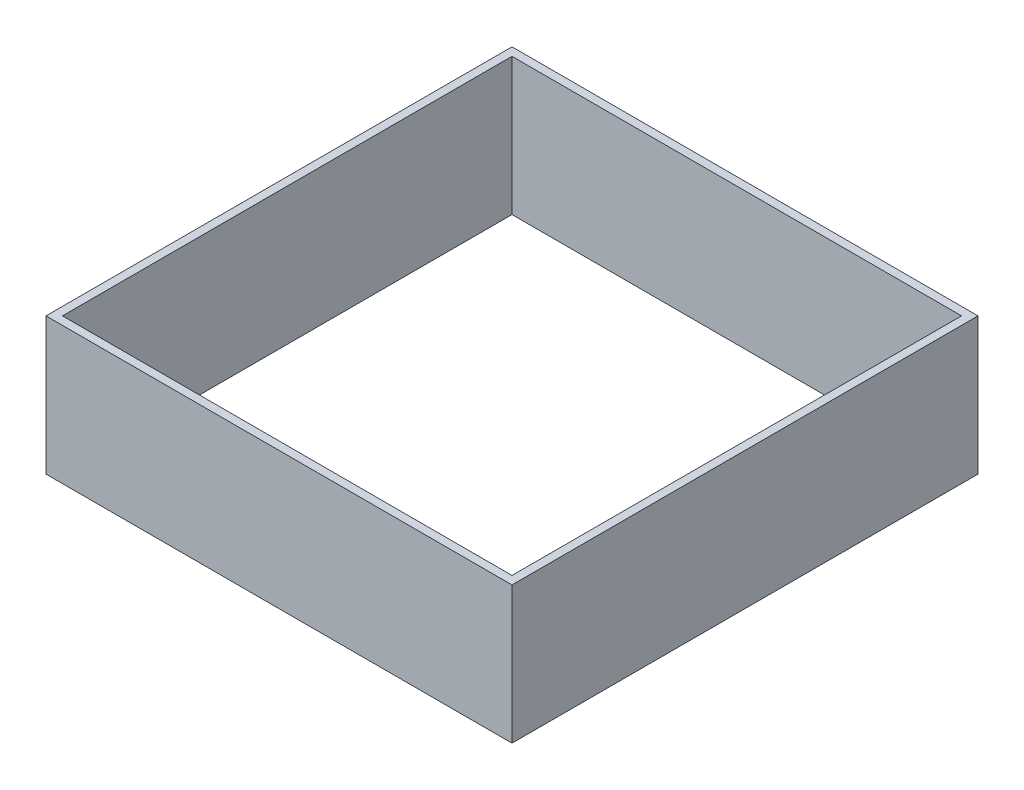
ISO-10303-21;
HEADER;
FILE_DESCRIPTION(('STEP AP214'),'2;1');
FILE_NAME('part.step','',(''),(''),'','','');
FILE_SCHEMA(('AUTOMOTIVE_DESIGN { 1 0 10303 214 1 1 1 1 }'));
ENDSEC;
DATA;
#1=APPLICATION_CONTEXT('core data for automotive mechanical design processes');
#2=APPLICATION_PROTOCOL_DEFINITION('international standard','automotive_design',2000,#1);
#3=PRODUCT_CONTEXT('',#1,'mechanical');
#4=PRODUCT('Part','Part','',(#3));
#5=PRODUCT_RELATED_PRODUCT_CATEGORY('part','',(#4));
#6=PRODUCT_DEFINITION_FORMATION('','',#4);
#7=PRODUCT_DEFINITION_CONTEXT('part definition',#1,'design');
#8=PRODUCT_DEFINITION('design','',#6,#7);
#9=PRODUCT_DEFINITION_SHAPE('','',#8);
#10=(LENGTH_UNIT() NAMED_UNIT(*) SI_UNIT(.MILLI.,.METRE.));
#11=(NAMED_UNIT(*) PLANE_ANGLE_UNIT() SI_UNIT($,.RADIAN.));
#12=(NAMED_UNIT(*) SI_UNIT($,.STERADIAN.) SOLID_ANGLE_UNIT());
#13=UNCERTAINTY_MEASURE_WITH_UNIT(LENGTH_MEASURE(1.E-05),#10,'distance_accuracy_value','');
#14=(GEOMETRIC_REPRESENTATION_CONTEXT(3) GLOBAL_UNCERTAINTY_ASSIGNED_CONTEXT((#13)) GLOBAL_UNIT_ASSIGNED_CONTEXT((#10,
#11,#12)) REPRESENTATION_CONTEXT('',''));
#15=CARTESIAN_POINT('',(0.,0.,0.));
#16=DIRECTION('',(0.,0.,1.));
#17=DIRECTION('',(1.,0.,0.));
#18=AXIS2_PLACEMENT_3D('',#15,#16,#17);
#19=CARTESIAN_POINT('',(0.,100.,0.));
#20=DIRECTION('',(0.,-1.,0.));
#21=DIRECTION('',(0.,0.,-1.));
#22=AXIS2_PLACEMENT_3D('',#19,#20,#21);
#23=PLANE('',#22);
#24=DIRECTION('',(0.,0.,-1.));
#25=VECTOR('',#24,1.);
#26=CARTESIAN_POINT('',(170.,100.,170.));
#27=LINE('',#26,#25);
#28=CARTESIAN_POINT('',(170.,100.,170.));
#29=VERTEX_POINT('',#28);
#30=CARTESIAN_POINT('',(170.,100.,-170.));
#31=VERTEX_POINT('',#30);
#32=EDGE_CURVE('E134',#29,#31,#27,.T.);
#33=ORIENTED_EDGE('',*,*,#32,.T.);
#34=DIRECTION('',(-1.,0.,0.));
#35=VECTOR('',#34,1.);
#36=CARTESIAN_POINT('',(-170.,100.,-170.));
#37=LINE('',#36,#35);
#38=CARTESIAN_POINT('',(-170.,100.,-170.));
#39=VERTEX_POINT('',#38);
#40=EDGE_CURVE('E137',#31,#39,#37,.T.);
#41=ORIENTED_EDGE('',*,*,#40,.T.);
#42=DIRECTION('',(0.,0.,1.));
#43=VECTOR('',#42,1.);
#44=CARTESIAN_POINT('',(-170.,100.,170.));
#45=LINE('',#44,#43);
#46=CARTESIAN_POINT('',(-170.,100.,170.));
#47=VERTEX_POINT('',#46);
#48=EDGE_CURVE('E140',#39,#47,#45,.T.);
#49=ORIENTED_EDGE('',*,*,#48,.T.);
#50=DIRECTION('',(1.,0.,0.));
#51=VECTOR('',#50,1.);
#52=CARTESIAN_POINT('',(-170.,100.,170.));
#53=LINE('',#52,#51);
#54=EDGE_CURVE('E142',#47,#29,#53,.T.);
#55=ORIENTED_EDGE('',*,*,#54,.T.);
#56=EDGE_LOOP('',(#33,#41,#49,#55));
#57=FACE_BOUND('',#56,.T.);
#58=DIRECTION('',(0.,0.,-1.));
#59=VECTOR('',#58,1.);
#60=CARTESIAN_POINT('',(164.,100.,164.));
#61=LINE('',#60,#59);
#62=CARTESIAN_POINT('',(164.,100.,164.));
#63=VERTEX_POINT('',#62);
#64=CARTESIAN_POINT('',(164.,100.,-164.));
#65=VERTEX_POINT('',#64);
#66=EDGE_CURVE('E98',#63,#65,#61,.T.);
#67=ORIENTED_EDGE('',*,*,#66,.F.);
#68=DIRECTION('',(1.,0.,0.));
#69=VECTOR('',#68,1.);
#70=CARTESIAN_POINT('',(-164.,100.,164.));
#71=LINE('',#70,#69);
#72=CARTESIAN_POINT('',(-164.,100.,164.));
#73=VERTEX_POINT('',#72);
#74=EDGE_CURVE('E120',#73,#63,#71,.T.);
#75=ORIENTED_EDGE('',*,*,#74,.F.);
#76=DIRECTION('',(0.,0.,1.));
#77=VECTOR('',#76,1.);
#78=CARTESIAN_POINT('',(-164.,100.,164.));
#79=LINE('',#78,#77);
#80=CARTESIAN_POINT('',(-164.,100.,-164.));
#81=VERTEX_POINT('',#80);
#82=EDGE_CURVE('E118',#81,#73,#79,.T.);
#83=ORIENTED_EDGE('',*,*,#82,.F.);
#84=DIRECTION('',(-1.,0.,0.));
#85=VECTOR('',#84,1.);
#86=CARTESIAN_POINT('',(-164.,100.,-164.));
#87=LINE('',#86,#85);
#88=EDGE_CURVE('E106',#65,#81,#87,.T.);
#89=ORIENTED_EDGE('',*,*,#88,.F.);
#90=EDGE_LOOP('',(#67,#75,#83,#89));
#91=FACE_BOUND('',#90,.T.);
#92=ADVANCED_FACE('F33',(#57,#91),#23,.F.);
#93=CARTESIAN_POINT('',(0.,0.,0.));
#94=DIRECTION('',(0.,-1.,0.));
#95=DIRECTION('',(0.,0.,-1.));
#96=AXIS2_PLACEMENT_3D('',#93,#94,#95);
#97=PLANE('',#96);
#98=DIRECTION('',(0.,0.,-1.));
#99=VECTOR('',#98,1.);
#100=CARTESIAN_POINT('',(170.,0.,170.));
#101=LINE('',#100,#99);
#102=CARTESIAN_POINT('',(170.,0.,170.));
#103=VERTEX_POINT('',#102);
#104=CARTESIAN_POINT('',(170.,0.,-170.));
#105=VERTEX_POINT('',#104);
#106=EDGE_CURVE('E114',#103,#105,#101,.T.);
#107=ORIENTED_EDGE('',*,*,#106,.F.);
#108=DIRECTION('',(1.,0.,0.));
#109=VECTOR('',#108,1.);
#110=CARTESIAN_POINT('',(-170.,0.,170.));
#111=LINE('',#110,#109);
#112=CARTESIAN_POINT('',(-170.,0.,170.));
#113=VERTEX_POINT('',#112);
#114=EDGE_CURVE('E138',#113,#103,#111,.T.);
#115=ORIENTED_EDGE('',*,*,#114,.F.);
#116=DIRECTION('',(0.,0.,1.));
#117=VECTOR('',#116,1.);
#118=CARTESIAN_POINT('',(-170.,0.,170.));
#119=LINE('',#118,#117);
#120=CARTESIAN_POINT('',(-170.,0.,-170.));
#121=VERTEX_POINT('',#120);
#122=EDGE_CURVE('E149',#121,#113,#119,.T.);
#123=ORIENTED_EDGE('',*,*,#122,.F.);
#124=DIRECTION('',(-1.,0.,0.));
#125=VECTOR('',#124,1.);
#126=CARTESIAN_POINT('',(-170.,0.,-170.));
#127=LINE('',#126,#125);
#128=EDGE_CURVE('E147',#105,#121,#127,.T.);
#129=ORIENTED_EDGE('',*,*,#128,.F.);
#130=EDGE_LOOP('',(#107,#115,#123,#129));
#131=FACE_BOUND('',#130,.T.);
#132=DIRECTION('',(1.,0.,0.));
#133=VECTOR('',#132,1.);
#134=CARTESIAN_POINT('',(-164.,0.,164.));
#135=LINE('',#134,#133);
#136=CARTESIAN_POINT('',(-164.,0.,164.));
#137=VERTEX_POINT('',#136);
#138=CARTESIAN_POINT('',(164.,0.,164.));
#139=VERTEX_POINT('',#138);
#140=EDGE_CURVE('E107',#137,#139,#135,.T.);
#141=ORIENTED_EDGE('',*,*,#140,.T.);
#142=DIRECTION('',(0.,0.,-1.));
#143=VECTOR('',#142,1.);
#144=CARTESIAN_POINT('',(164.,0.,164.));
#145=LINE('',#144,#143);
#146=CARTESIAN_POINT('',(164.,0.,-164.));
#147=VERTEX_POINT('',#146);
#148=EDGE_CURVE('E56',#139,#147,#145,.T.);
#149=ORIENTED_EDGE('',*,*,#148,.T.);
#150=DIRECTION('',(-1.,0.,0.));
#151=VECTOR('',#150,1.);
#152=CARTESIAN_POINT('',(-164.,0.,-164.));
#153=LINE('',#152,#151);
#154=CARTESIAN_POINT('',(-164.,0.,-164.));
#155=VERTEX_POINT('',#154);
#156=EDGE_CURVE('E113',#147,#155,#153,.T.);
#157=ORIENTED_EDGE('',*,*,#156,.T.);
#158=DIRECTION('',(0.,0.,1.));
#159=VECTOR('',#158,1.);
#160=CARTESIAN_POINT('',(-164.,0.,164.));
#161=LINE('',#160,#159);
#162=EDGE_CURVE('E126',#155,#137,#161,.T.);
#163=ORIENTED_EDGE('',*,*,#162,.T.);
#164=EDGE_LOOP('',(#141,#149,#157,#163));
#165=FACE_BOUND('',#164,.T.);
#166=ADVANCED_FACE('F167',(#131,#165),#97,.T.);
#167=CARTESIAN_POINT('',(170.,100.,170.));
#168=DIRECTION('',(-1.,0.,0.));
#169=DIRECTION('',(0.,0.,1.));
#170=AXIS2_PLACEMENT_3D('',#167,#168,#169);
#171=PLANE('',#170);
#172=ORIENTED_EDGE('',*,*,#106,.T.);
#173=DIRECTION('',(0.,-1.,0.));
#174=VECTOR('',#173,1.);
#175=CARTESIAN_POINT('',(170.,100.,-170.));
#176=LINE('',#175,#174);
#177=EDGE_CURVE('E11',#31,#105,#176,.T.);
#178=ORIENTED_EDGE('',*,*,#177,.F.);
#179=ORIENTED_EDGE('',*,*,#32,.F.);
#180=DIRECTION('',(0.,-1.,0.));
#181=VECTOR('',#180,1.);
#182=CARTESIAN_POINT('',(170.,100.,170.));
#183=LINE('',#182,#181);
#184=EDGE_CURVE('E144',#29,#103,#183,.T.);
#185=ORIENTED_EDGE('',*,*,#184,.T.);
#186=EDGE_LOOP('',(#172,#178,#179,#185));
#187=FACE_BOUND('',#186,.T.);
#188=ADVANCED_FACE('F35',(#187),#171,.F.);
#189=CARTESIAN_POINT('',(-170.,100.,-170.));
#190=DIRECTION('',(0.,0.,1.));
#191=DIRECTION('',(1.,0.,0.));
#192=AXIS2_PLACEMENT_3D('',#189,#190,#191);
#193=PLANE('',#192);
#194=ORIENTED_EDGE('',*,*,#128,.T.);
#195=DIRECTION('',(0.,-1.,0.));
#196=VECTOR('',#195,1.);
#197=CARTESIAN_POINT('',(-170.,100.,-170.));
#198=LINE('',#197,#196);
#199=EDGE_CURVE('E41',#39,#121,#198,.T.);
#200=ORIENTED_EDGE('',*,*,#199,.F.);
#201=ORIENTED_EDGE('',*,*,#40,.F.);
#202=ORIENTED_EDGE('',*,*,#177,.T.);
#203=EDGE_LOOP('',(#194,#200,#201,#202));
#204=FACE_BOUND('',#203,.T.);
#205=ADVANCED_FACE('F177',(#204),#193,.F.);
#206=CARTESIAN_POINT('',(-170.,100.,170.));
#207=DIRECTION('',(1.,0.,0.));
#208=DIRECTION('',(0.,0.,-1.));
#209=AXIS2_PLACEMENT_3D('',#206,#207,#208);
#210=PLANE('',#209);
#211=ORIENTED_EDGE('',*,*,#122,.T.);
#212=DIRECTION('',(0.,-1.,0.));
#213=VECTOR('',#212,1.);
#214=CARTESIAN_POINT('',(-170.,100.,170.));
#215=LINE('',#214,#213);
#216=EDGE_CURVE('E154',#47,#113,#215,.T.);
#217=ORIENTED_EDGE('',*,*,#216,.F.);
#218=ORIENTED_EDGE('',*,*,#48,.F.);
#219=ORIENTED_EDGE('',*,*,#199,.T.);
#220=EDGE_LOOP('',(#211,#217,#218,#219));
#221=FACE_BOUND('',#220,.T.);
#222=ADVANCED_FACE('F161',(#221),#210,.F.);
#223=CARTESIAN_POINT('',(-170.,100.,170.));
#224=DIRECTION('',(0.,0.,-1.));
#225=DIRECTION('',(-1.,0.,0.));
#226=AXIS2_PLACEMENT_3D('',#223,#224,#225);
#227=PLANE('',#226);
#228=ORIENTED_EDGE('',*,*,#114,.T.);
#229=ORIENTED_EDGE('',*,*,#184,.F.);
#230=ORIENTED_EDGE('',*,*,#54,.F.);
#231=ORIENTED_EDGE('',*,*,#216,.T.);
#232=EDGE_LOOP('',(#228,#229,#230,#231));
#233=FACE_BOUND('',#232,.T.);
#234=ADVANCED_FACE('F171',(#233),#227,.F.);
#235=CARTESIAN_POINT('',(164.,100.,164.));
#236=DIRECTION('',(-1.,0.,0.));
#237=DIRECTION('',(0.,0.,1.));
#238=AXIS2_PLACEMENT_3D('',#235,#236,#237);
#239=PLANE('',#238);
#240=ORIENTED_EDGE('',*,*,#148,.F.);
#241=DIRECTION('',(0.,-1.,0.));
#242=VECTOR('',#241,1.);
#243=CARTESIAN_POINT('',(164.,100.,164.));
#244=LINE('',#243,#242);
#245=EDGE_CURVE('E102',#63,#139,#244,.T.);
#246=ORIENTED_EDGE('',*,*,#245,.F.);
#247=ORIENTED_EDGE('',*,*,#66,.T.);
#248=DIRECTION('',(0.,-1.,0.));
#249=VECTOR('',#248,1.);
#250=CARTESIAN_POINT('',(164.,100.,-164.));
#251=LINE('',#250,#249);
#252=EDGE_CURVE('E101',#65,#147,#251,.T.);
#253=ORIENTED_EDGE('',*,*,#252,.T.);
#254=EDGE_LOOP('',(#240,#246,#247,#253));
#255=FACE_BOUND('',#254,.T.);
#256=ADVANCED_FACE('F100',(#255),#239,.T.);
#257=CARTESIAN_POINT('',(-164.,100.,-164.));
#258=DIRECTION('',(0.,0.,1.));
#259=DIRECTION('',(1.,0.,0.));
#260=AXIS2_PLACEMENT_3D('',#257,#258,#259);
#261=PLANE('',#260);
#262=ORIENTED_EDGE('',*,*,#156,.F.);
#263=ORIENTED_EDGE('',*,*,#252,.F.);
#264=ORIENTED_EDGE('',*,*,#88,.T.);
#265=DIRECTION('',(0.,-1.,0.));
#266=VECTOR('',#265,1.);
#267=CARTESIAN_POINT('',(-164.,100.,-164.));
#268=LINE('',#267,#266);
#269=EDGE_CURVE('E115',#81,#155,#268,.T.);
#270=ORIENTED_EDGE('',*,*,#269,.T.);
#271=EDGE_LOOP('',(#262,#263,#264,#270));
#272=FACE_BOUND('',#271,.T.);
#273=ADVANCED_FACE('F110',(#272),#261,.T.);
#274=CARTESIAN_POINT('',(-164.,100.,164.));
#275=DIRECTION('',(1.,0.,0.));
#276=DIRECTION('',(0.,0.,-1.));
#277=AXIS2_PLACEMENT_3D('',#274,#275,#276);
#278=PLANE('',#277);
#279=ORIENTED_EDGE('',*,*,#162,.F.);
#280=ORIENTED_EDGE('',*,*,#269,.F.);
#281=ORIENTED_EDGE('',*,*,#82,.T.);
#282=DIRECTION('',(0.,-1.,0.));
#283=VECTOR('',#282,1.);
#284=CARTESIAN_POINT('',(-164.,100.,164.));
#285=LINE('',#284,#283);
#286=EDGE_CURVE('E48',#73,#137,#285,.T.);
#287=ORIENTED_EDGE('',*,*,#286,.T.);
#288=EDGE_LOOP('',(#279,#280,#281,#287));
#289=FACE_BOUND('',#288,.T.);
#290=ADVANCED_FACE('F200',(#289),#278,.T.);
#291=CARTESIAN_POINT('',(-164.,100.,164.));
#292=DIRECTION('',(0.,0.,-1.));
#293=DIRECTION('',(-1.,0.,0.));
#294=AXIS2_PLACEMENT_3D('',#291,#292,#293);
#295=PLANE('',#294);
#296=ORIENTED_EDGE('',*,*,#140,.F.);
#297=ORIENTED_EDGE('',*,*,#286,.F.);
#298=ORIENTED_EDGE('',*,*,#74,.T.);
#299=ORIENTED_EDGE('',*,*,#245,.T.);
#300=EDGE_LOOP('',(#296,#297,#298,#299));
#301=FACE_BOUND('',#300,.T.);
#302=ADVANCED_FACE('F204',(#301),#295,.T.);
#303=CLOSED_SHELL('',(#92,#166,#188,#205,#222,#234,#256,#273,#290,#302));
#304=MANIFOLD_SOLID_BREP('B2',#303);
#305=ADVANCED_BREP_SHAPE_REPRESENTATION('',(#18,#304),#14);
#306=SHAPE_DEFINITION_REPRESENTATION(#9,#305);
ENDSEC;
END-ISO-10303-21;
